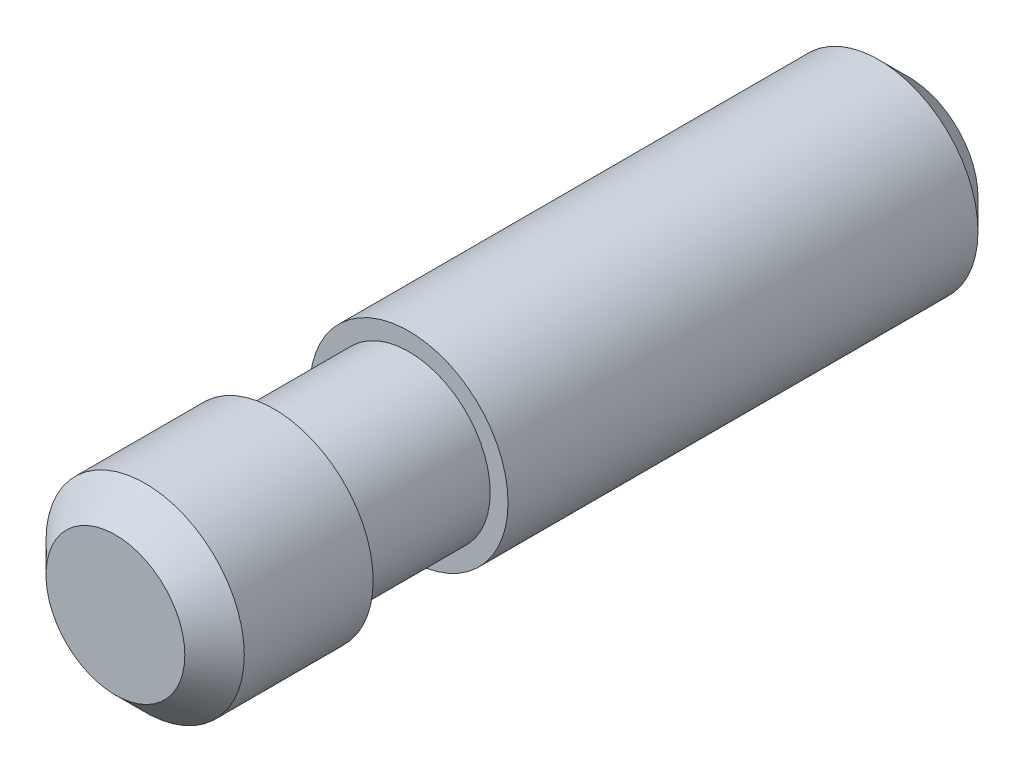
ISO-10303-21;
HEADER;
FILE_DESCRIPTION(('STEP AP214'),'2;1');
FILE_NAME('part.step','',(''),(''),'','','');
FILE_SCHEMA(('AUTOMOTIVE_DESIGN { 1 0 10303 214 1 1 1 1 }'));
ENDSEC;
DATA;
#1=APPLICATION_CONTEXT('core data for automotive mechanical design processes');
#2=APPLICATION_PROTOCOL_DEFINITION('international standard','automotive_design',2000,#1);
#3=PRODUCT_CONTEXT('',#1,'mechanical');
#4=PRODUCT('Part','Part','',(#3));
#5=PRODUCT_RELATED_PRODUCT_CATEGORY('part','',(#4));
#6=PRODUCT_DEFINITION_FORMATION('','',#4);
#7=PRODUCT_DEFINITION_CONTEXT('part definition',#1,'design');
#8=PRODUCT_DEFINITION('design','',#6,#7);
#9=PRODUCT_DEFINITION_SHAPE('','',#8);
#10=(LENGTH_UNIT() NAMED_UNIT(*) SI_UNIT(.MILLI.,.METRE.));
#11=(NAMED_UNIT(*) PLANE_ANGLE_UNIT() SI_UNIT($,.RADIAN.));
#12=(NAMED_UNIT(*) SI_UNIT($,.STERADIAN.) SOLID_ANGLE_UNIT());
#13=UNCERTAINTY_MEASURE_WITH_UNIT(LENGTH_MEASURE(1.E-05),#10,'distance_accuracy_value','');
#14=(GEOMETRIC_REPRESENTATION_CONTEXT(3) GLOBAL_UNCERTAINTY_ASSIGNED_CONTEXT((#13)) GLOBAL_UNIT_ASSIGNED_CONTEXT((#10,
#11,#12)) REPRESENTATION_CONTEXT('',''));
#15=CARTESIAN_POINT('',(0.,0.,0.));
#16=DIRECTION('',(0.,0.,1.));
#17=DIRECTION('',(1.,0.,0.));
#18=AXIS2_PLACEMENT_3D('',#15,#16,#17);
#19=CARTESIAN_POINT('',(0.,0.,20.));
#20=DIRECTION('',(0.,0.,-1.));
#21=DIRECTION('',(-1.,0.,0.));
#22=AXIS2_PLACEMENT_3D('',#19,#20,#21);
#23=CYLINDRICAL_SURFACE('',#22,2.5);
#24=CARTESIAN_POINT('',(0.,0.,19.25));
#25=DIRECTION('',(0.,0.,1.));
#26=DIRECTION('',(1.,0.,0.));
#27=AXIS2_PLACEMENT_3D('',#24,#25,#26);
#28=CIRCLE('',#27,2.5);
#29=CARTESIAN_POINT('',(2.5,0.,19.25));
#30=VERTEX_POINT('',#29);
#31=EDGE_CURVE('E47',#30,#30,#28,.F.);
#32=ORIENTED_EDGE('',*,*,#31,.T.);
#33=EDGE_LOOP('',(#32));
#34=FACE_BOUND('',#33,.T.);
#35=CARTESIAN_POINT('',(0.,0.,16.));
#36=DIRECTION('',(0.,0.,1.));
#37=DIRECTION('',(1.,0.,0.));
#38=AXIS2_PLACEMENT_3D('',#35,#36,#37);
#39=CIRCLE('',#38,2.5);
#40=CARTESIAN_POINT('',(2.5,0.,16.));
#41=VERTEX_POINT('',#40);
#42=EDGE_CURVE('E60',#41,#41,#39,.T.);
#43=ORIENTED_EDGE('',*,*,#42,.T.);
#44=EDGE_LOOP('',(#43));
#45=FACE_BOUND('',#44,.T.);
#46=ADVANCED_FACE('F39',(#34,#45),#23,.T.);
#47=CARTESIAN_POINT('',(0.,0.,20.));
#48=DIRECTION('',(0.,0.,1.));
#49=DIRECTION('',(1.,0.,0.));
#50=AXIS2_PLACEMENT_3D('',#47,#48,#49);
#51=PLANE('',#50);
#52=CARTESIAN_POINT('',(0.,0.,20.));
#53=DIRECTION('',(0.,0.,1.));
#54=DIRECTION('',(1.,0.,0.));
#55=AXIS2_PLACEMENT_3D('',#52,#53,#54);
#56=CIRCLE('',#55,1.75);
#57=CARTESIAN_POINT('',(1.75,0.,20.));
#58=VERTEX_POINT('',#57);
#59=EDGE_CURVE('E55',#58,#58,#56,.T.);
#60=ORIENTED_EDGE('',*,*,#59,.T.);
#61=EDGE_LOOP('',(#60));
#62=FACE_BOUND('',#61,.T.);
#63=ADVANCED_FACE('F87',(#62),#51,.T.);
#64=CARTESIAN_POINT('',(0.,0.,20.));
#65=DIRECTION('',(0.,0.,-1.));
#66=DIRECTION('',(-1.,0.,0.));
#67=AXIS2_PLACEMENT_3D('',#64,#65,#66);
#68=CONICAL_SURFACE('',#67,1.75,0.785398163397449);
#69=ORIENTED_EDGE('',*,*,#31,.F.);
#70=EDGE_LOOP('',(#69));
#71=FACE_BOUND('',#70,.T.);
#72=ORIENTED_EDGE('',*,*,#59,.F.);
#73=EDGE_LOOP('',(#72));
#74=FACE_BOUND('',#73,.T.);
#75=ADVANCED_FACE('F91',(#71,#74),#68,.T.);
#76=CARTESIAN_POINT('',(0.,2.5,16.));
#77=DIRECTION('',(0.,0.,-1.));
#78=DIRECTION('',(-1.,0.,0.));
#79=AXIS2_PLACEMENT_3D('',#76,#77,#78);
#80=PLANE('',#79);
#81=CARTESIAN_POINT('',(0.,0.,16.));
#82=DIRECTION('',(0.,0.,1.));
#83=DIRECTION('',(1.,0.,0.));
#84=AXIS2_PLACEMENT_3D('',#81,#82,#83);
#85=CIRCLE('',#84,2.05);
#86=CARTESIAN_POINT('',(2.05,0.,16.));
#87=VERTEX_POINT('',#86);
#88=EDGE_CURVE('E63',#87,#87,#85,.T.);
#89=ORIENTED_EDGE('',*,*,#88,.T.);
#90=EDGE_LOOP('',(#89));
#91=FACE_BOUND('',#90,.T.);
#92=ORIENTED_EDGE('',*,*,#42,.F.);
#93=EDGE_LOOP('',(#92));
#94=FACE_BOUND('',#93,.T.);
#95=ADVANCED_FACE('F97',(#91,#94),#80,.T.);
#96=CARTESIAN_POINT('',(0.,0.,20.));
#97=DIRECTION('',(0.,0.,1.));
#98=DIRECTION('',(1.,0.,0.));
#99=AXIS2_PLACEMENT_3D('',#96,#97,#98);
#100=CYLINDRICAL_SURFACE('',#99,2.05);
#101=CARTESIAN_POINT('',(0.,0.,12.6));
#102=DIRECTION('',(0.,0.,1.));
#103=DIRECTION('',(1.,0.,0.));
#104=AXIS2_PLACEMENT_3D('',#101,#102,#103);
#105=CIRCLE('',#104,2.05);
#106=CARTESIAN_POINT('',(2.05,0.,12.6));
#107=VERTEX_POINT('',#106);
#108=EDGE_CURVE('E66',#107,#107,#105,.T.);
#109=ORIENTED_EDGE('',*,*,#108,.T.);
#110=EDGE_LOOP('',(#109));
#111=FACE_BOUND('',#110,.T.);
#112=ORIENTED_EDGE('',*,*,#88,.F.);
#113=EDGE_LOOP('',(#112));
#114=FACE_BOUND('',#113,.T.);
#115=ADVANCED_FACE('F99',(#111,#114),#100,.T.);
#116=CARTESIAN_POINT('',(0.,2.05,12.6));
#117=DIRECTION('',(0.,0.,1.));
#118=DIRECTION('',(1.,0.,0.));
#119=AXIS2_PLACEMENT_3D('',#116,#117,#118);
#120=PLANE('',#119);
#121=CARTESIAN_POINT('',(0.,0.,12.6));
#122=DIRECTION('',(0.,0.,1.));
#123=DIRECTION('',(1.,0.,0.));
#124=AXIS2_PLACEMENT_3D('',#121,#122,#123);
#125=CIRCLE('',#124,2.5);
#126=CARTESIAN_POINT('',(2.5,0.,12.6));
#127=VERTEX_POINT('',#126);
#128=EDGE_CURVE('E69',#127,#127,#125,.T.);
#129=ORIENTED_EDGE('',*,*,#128,.T.);
#130=EDGE_LOOP('',(#129));
#131=FACE_BOUND('',#130,.T.);
#132=ORIENTED_EDGE('',*,*,#108,.F.);
#133=EDGE_LOOP('',(#132));
#134=FACE_BOUND('',#133,.T.);
#135=ADVANCED_FACE('F73',(#131,#134),#120,.T.);
#136=CARTESIAN_POINT('',(0.,0.,0.));
#137=DIRECTION('',(0.,0.,1.));
#138=DIRECTION('',(1.,0.,0.));
#139=AXIS2_PLACEMENT_3D('',#136,#137,#138);
#140=PLANE('',#139);
#141=CARTESIAN_POINT('',(0.,0.,0.));
#142=DIRECTION('',(0.,0.,1.));
#143=DIRECTION('',(1.,0.,0.));
#144=AXIS2_PLACEMENT_3D('',#141,#142,#143);
#145=CIRCLE('',#144,1.75);
#146=CARTESIAN_POINT('',(1.75,0.,0.));
#147=VERTEX_POINT('',#146);
#148=EDGE_CURVE('E10',#147,#147,#145,.F.);
#149=ORIENTED_EDGE('',*,*,#148,.T.);
#150=EDGE_LOOP('',(#149));
#151=FACE_BOUND('',#150,.T.);
#152=ADVANCED_FACE('F83',(#151),#140,.F.);
#153=CARTESIAN_POINT('',(0.,0.,0.749999999999997));
#154=DIRECTION('',(0.,0.,1.));
#155=DIRECTION('',(1.,0.,0.));
#156=AXIS2_PLACEMENT_3D('',#153,#154,#155);
#157=CONICAL_SURFACE('',#156,2.5,0.785398163397449);
#158=ORIENTED_EDGE('',*,*,#148,.F.);
#159=EDGE_LOOP('',(#158));
#160=FACE_BOUND('',#159,.T.);
#161=CARTESIAN_POINT('',(0.,0.,0.749999999999997));
#162=DIRECTION('',(0.,0.,1.));
#163=DIRECTION('',(1.,0.,0.));
#164=AXIS2_PLACEMENT_3D('',#161,#162,#163);
#165=CIRCLE('',#164,2.5);
#166=CARTESIAN_POINT('',(2.5,0.,0.749999999999997));
#167=VERTEX_POINT('',#166);
#168=EDGE_CURVE('E51',#167,#167,#165,.T.);
#169=ORIENTED_EDGE('',*,*,#168,.F.);
#170=EDGE_LOOP('',(#169));
#171=FACE_BOUND('',#170,.T.);
#172=ADVANCED_FACE('F42',(#160,#171),#157,.T.);
#173=ORIENTED_EDGE('',*,*,#168,.T.);
#174=EDGE_LOOP('',(#173));
#175=FACE_BOUND('',#174,.T.);
#176=ORIENTED_EDGE('',*,*,#128,.F.);
#177=EDGE_LOOP('',(#176));
#178=FACE_BOUND('',#177,.T.);
#179=ADVANCED_FACE('F76',(#175,#178),#23,.T.);
#180=CLOSED_SHELL('',(#46,#63,#75,#95,#115,#135,#152,#172,#179));
#181=MANIFOLD_SOLID_BREP('B2',#180);
#182=ADVANCED_BREP_SHAPE_REPRESENTATION('',(#18,#181),#14);
#183=SHAPE_DEFINITION_REPRESENTATION(#9,#182);
ENDSEC;
END-ISO-10303-21;
